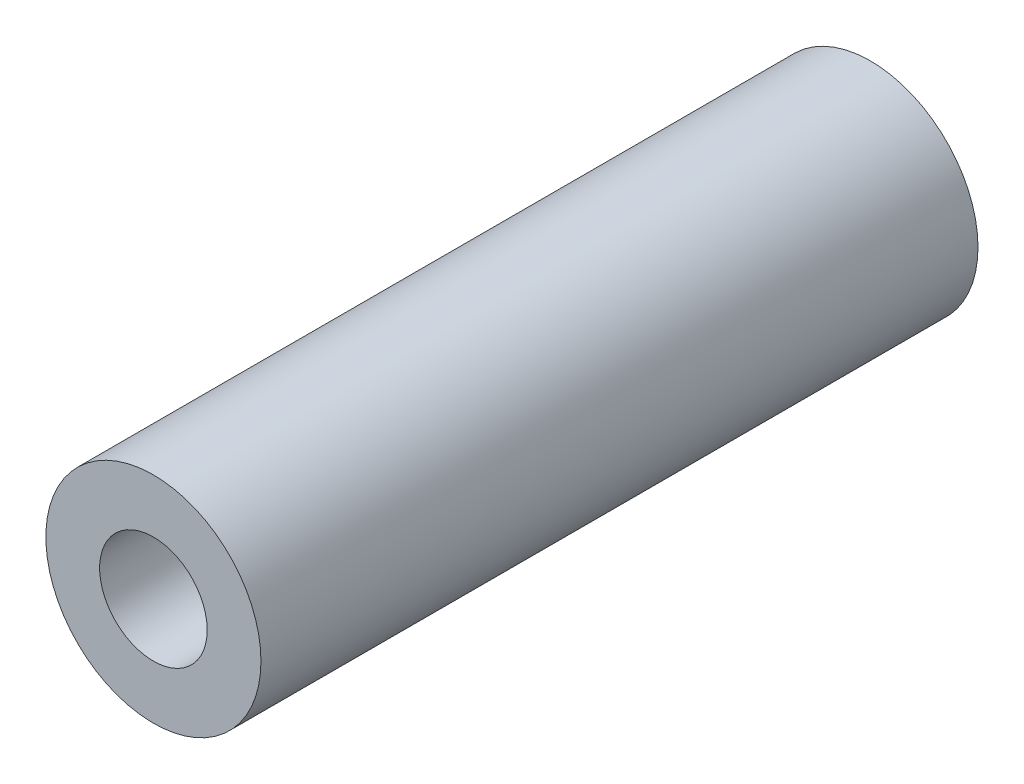
ISO-10303-21;
HEADER;
FILE_DESCRIPTION(('STEP AP214'),'2;1');
FILE_NAME('part.step','',(''),(''),'','','');
FILE_SCHEMA(('AUTOMOTIVE_DESIGN { 1 0 10303 214 1 1 1 1 }'));
ENDSEC;
DATA;
#1=APPLICATION_CONTEXT('core data for automotive mechanical design processes');
#2=APPLICATION_PROTOCOL_DEFINITION('international standard','automotive_design',2000,#1);
#3=PRODUCT_CONTEXT('',#1,'mechanical');
#4=PRODUCT('Part','Part','',(#3));
#5=PRODUCT_RELATED_PRODUCT_CATEGORY('part','',(#4));
#6=PRODUCT_DEFINITION_FORMATION('','',#4);
#7=PRODUCT_DEFINITION_CONTEXT('part definition',#1,'design');
#8=PRODUCT_DEFINITION('design','',#6,#7);
#9=PRODUCT_DEFINITION_SHAPE('','',#8);
#10=(LENGTH_UNIT() NAMED_UNIT(*) SI_UNIT(.MILLI.,.METRE.));
#11=(NAMED_UNIT(*) PLANE_ANGLE_UNIT() SI_UNIT($,.RADIAN.));
#12=(NAMED_UNIT(*) SI_UNIT($,.STERADIAN.) SOLID_ANGLE_UNIT());
#13=UNCERTAINTY_MEASURE_WITH_UNIT(LENGTH_MEASURE(1.E-05),#10,'distance_accuracy_value','');
#14=(GEOMETRIC_REPRESENTATION_CONTEXT(3) GLOBAL_UNCERTAINTY_ASSIGNED_CONTEXT((#13)) GLOBAL_UNIT_ASSIGNED_CONTEXT((#10,
#11,#12)) REPRESENTATION_CONTEXT('',''));
#15=CARTESIAN_POINT('',(0.,0.,0.));
#16=DIRECTION('',(0.,0.,1.));
#17=DIRECTION('',(1.,0.,0.));
#18=AXIS2_PLACEMENT_3D('',#15,#16,#17);
#19=CARTESIAN_POINT('',(0.,0.,20.));
#20=DIRECTION('',(0.,0.,-1.));
#21=DIRECTION('',(-1.,0.,0.));
#22=AXIS2_PLACEMENT_3D('',#19,#20,#21);
#23=CYLINDRICAL_SURFACE('',#22,3.);
#24=CARTESIAN_POINT('',(0.,0.,20.));
#25=DIRECTION('',(0.,0.,1.));
#26=DIRECTION('',(1.,0.,0.));
#27=AXIS2_PLACEMENT_3D('',#24,#25,#26);
#28=CIRCLE('',#27,3.);
#29=CARTESIAN_POINT('',(3.,0.,20.));
#30=VERTEX_POINT('',#29);
#31=EDGE_CURVE('E10',#30,#30,#28,.T.);
#32=ORIENTED_EDGE('',*,*,#31,.F.);
#33=EDGE_LOOP('',(#32));
#34=FACE_BOUND('',#33,.T.);
#35=CARTESIAN_POINT('',(0.,0.,0.));
#36=DIRECTION('',(0.,0.,1.));
#37=DIRECTION('',(1.,0.,0.));
#38=AXIS2_PLACEMENT_3D('',#35,#36,#37);
#39=CIRCLE('',#38,3.);
#40=CARTESIAN_POINT('',(3.,0.,0.));
#41=VERTEX_POINT('',#40);
#42=EDGE_CURVE('E42',#41,#41,#39,.T.);
#43=ORIENTED_EDGE('',*,*,#42,.T.);
#44=EDGE_LOOP('',(#43));
#45=FACE_BOUND('',#44,.T.);
#46=ADVANCED_FACE('F39',(#34,#45),#23,.T.);
#47=CARTESIAN_POINT('',(0.,0.,20.));
#48=DIRECTION('',(0.,0.,1.));
#49=DIRECTION('',(1.,0.,0.));
#50=AXIS2_PLACEMENT_3D('',#47,#48,#49);
#51=PLANE('',#50);
#52=CARTESIAN_POINT('',(0.,0.,20.));
#53=DIRECTION('',(0.,0.,1.));
#54=DIRECTION('',(1.,0.,0.));
#55=AXIS2_PLACEMENT_3D('',#52,#53,#54);
#56=CIRCLE('',#55,1.5);
#57=CARTESIAN_POINT('',(1.5,0.,20.));
#58=VERTEX_POINT('',#57);
#59=EDGE_CURVE('E51',#58,#58,#56,.T.);
#60=ORIENTED_EDGE('',*,*,#59,.F.);
#61=EDGE_LOOP('',(#60));
#62=FACE_BOUND('',#61,.T.);
#63=ORIENTED_EDGE('',*,*,#31,.T.);
#64=EDGE_LOOP('',(#63));
#65=FACE_BOUND('',#64,.T.);
#66=ADVANCED_FACE('F66',(#62,#65),#51,.T.);
#67=CARTESIAN_POINT('',(0.,0.,0.));
#68=DIRECTION('',(0.,0.,1.));
#69=DIRECTION('',(1.,0.,0.));
#70=AXIS2_PLACEMENT_3D('',#67,#68,#69);
#71=PLANE('',#70);
#72=CARTESIAN_POINT('',(0.,0.,0.));
#73=DIRECTION('',(0.,0.,1.));
#74=DIRECTION('',(1.,0.,0.));
#75=AXIS2_PLACEMENT_3D('',#72,#73,#74);
#76=CIRCLE('',#75,1.5);
#77=CARTESIAN_POINT('',(1.5,0.,0.));
#78=VERTEX_POINT('',#77);
#79=EDGE_CURVE('E49',#78,#78,#76,.T.);
#80=ORIENTED_EDGE('',*,*,#79,.T.);
#81=EDGE_LOOP('',(#80));
#82=FACE_BOUND('',#81,.T.);
#83=ORIENTED_EDGE('',*,*,#42,.F.);
#84=EDGE_LOOP('',(#83));
#85=FACE_BOUND('',#84,.T.);
#86=ADVANCED_FACE('F57',(#82,#85),#71,.F.);
#87=CARTESIAN_POINT('',(0.,0.,0.));
#88=DIRECTION('',(0.,0.,1.));
#89=DIRECTION('',(1.,0.,0.));
#90=AXIS2_PLACEMENT_3D('',#87,#88,#89);
#91=CYLINDRICAL_SURFACE('',#90,1.5);
#92=ORIENTED_EDGE('',*,*,#79,.F.);
#93=EDGE_LOOP('',(#92));
#94=FACE_BOUND('',#93,.T.);
#95=ORIENTED_EDGE('',*,*,#59,.T.);
#96=EDGE_LOOP('',(#95));
#97=FACE_BOUND('',#96,.T.);
#98=ADVANCED_FACE('F60',(#94,#97),#91,.F.);
#99=CLOSED_SHELL('',(#46,#66,#86,#98));
#100=MANIFOLD_SOLID_BREP('B2',#99);
#101=ADVANCED_BREP_SHAPE_REPRESENTATION('',(#18,#100),#14);
#102=SHAPE_DEFINITION_REPRESENTATION(#9,#101);
ENDSEC;
END-ISO-10303-21;
